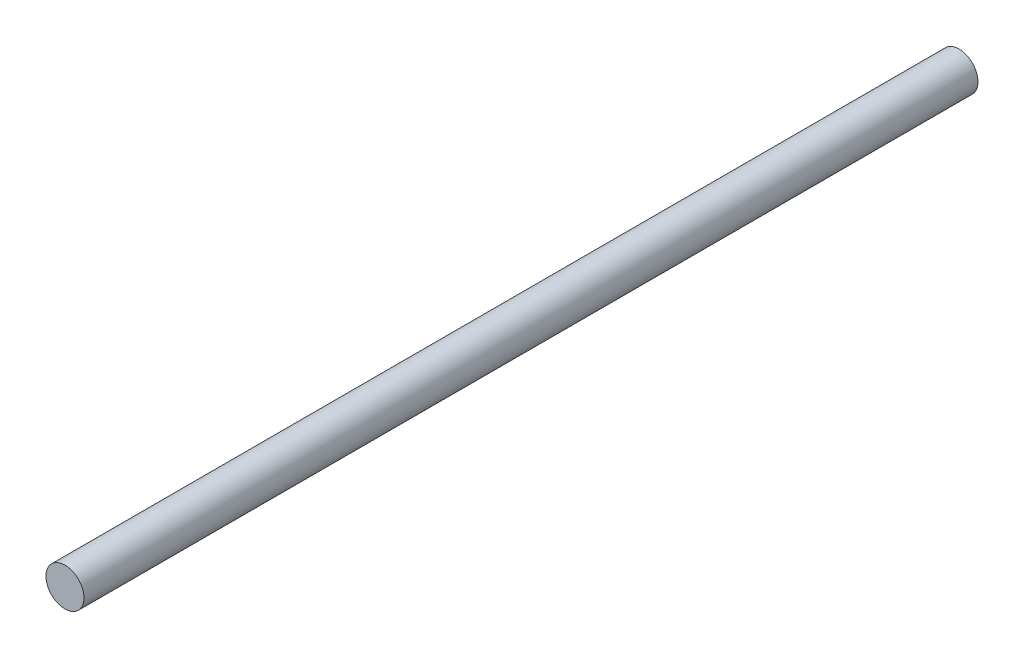
ISO-10303-21;
HEADER;
FILE_DESCRIPTION(('STEP AP214'),'2;1');
FILE_NAME('part.step','',(''),(''),'','','');
FILE_SCHEMA(('AUTOMOTIVE_DESIGN { 1 0 10303 214 1 1 1 1 }'));
ENDSEC;
DATA;
#1=APPLICATION_CONTEXT('core data for automotive mechanical design processes');
#2=APPLICATION_PROTOCOL_DEFINITION('international standard','automotive_design',2000,#1);
#3=PRODUCT_CONTEXT('',#1,'mechanical');
#4=PRODUCT('Part','Part','',(#3));
#5=PRODUCT_RELATED_PRODUCT_CATEGORY('part','',(#4));
#6=PRODUCT_DEFINITION_FORMATION('','',#4);
#7=PRODUCT_DEFINITION_CONTEXT('part definition',#1,'design');
#8=PRODUCT_DEFINITION('design','',#6,#7);
#9=PRODUCT_DEFINITION_SHAPE('','',#8);
#10=(LENGTH_UNIT() NAMED_UNIT(*) SI_UNIT(.MILLI.,.METRE.));
#11=(NAMED_UNIT(*) PLANE_ANGLE_UNIT() SI_UNIT($,.RADIAN.));
#12=(NAMED_UNIT(*) SI_UNIT($,.STERADIAN.) SOLID_ANGLE_UNIT());
#13=UNCERTAINTY_MEASURE_WITH_UNIT(LENGTH_MEASURE(1.E-05),#10,'distance_accuracy_value','');
#14=(GEOMETRIC_REPRESENTATION_CONTEXT(3) GLOBAL_UNCERTAINTY_ASSIGNED_CONTEXT((#13)) GLOBAL_UNIT_ASSIGNED_CONTEXT((#10,
#11,#12)) REPRESENTATION_CONTEXT('',''));
#15=CARTESIAN_POINT('',(0.,0.,0.));
#16=DIRECTION('',(0.,0.,1.));
#17=DIRECTION('',(1.,0.,0.));
#18=AXIS2_PLACEMENT_3D('',#15,#16,#17);
#19=CARTESIAN_POINT('',(0.,0.,149.352));
#20=DIRECTION('',(0.,0.,-1.));
#21=DIRECTION('',(-1.,0.,0.));
#22=AXIS2_PLACEMENT_3D('',#19,#20,#21);
#23=CYLINDRICAL_SURFACE('',#22,3.175);
#24=CARTESIAN_POINT('',(0.,0.,149.352));
#25=DIRECTION('',(0.,0.,1.));
#26=DIRECTION('',(1.,0.,0.));
#27=AXIS2_PLACEMENT_3D('',#24,#25,#26);
#28=CIRCLE('',#27,3.175);
#29=CARTESIAN_POINT('',(3.175,0.,149.352));
#30=VERTEX_POINT('',#29);
#31=EDGE_CURVE('E10',#30,#30,#28,.T.);
#32=ORIENTED_EDGE('',*,*,#31,.F.);
#33=EDGE_LOOP('',(#32));
#34=FACE_BOUND('',#33,.T.);
#35=CARTESIAN_POINT('',(0.,0.,0.));
#36=DIRECTION('',(0.,0.,1.));
#37=DIRECTION('',(1.,0.,0.));
#38=AXIS2_PLACEMENT_3D('',#35,#36,#37);
#39=CIRCLE('',#38,3.175);
#40=CARTESIAN_POINT('',(3.175,0.,0.));
#41=VERTEX_POINT('',#40);
#42=EDGE_CURVE('E40',#41,#41,#39,.T.);
#43=ORIENTED_EDGE('',*,*,#42,.T.);
#44=EDGE_LOOP('',(#43));
#45=FACE_BOUND('',#44,.T.);
#46=ADVANCED_FACE('F37',(#34,#45),#23,.T.);
#47=CARTESIAN_POINT('',(0.,0.,149.352));
#48=DIRECTION('',(0.,0.,1.));
#49=DIRECTION('',(1.,0.,0.));
#50=AXIS2_PLACEMENT_3D('',#47,#48,#49);
#51=PLANE('',#50);
#52=ORIENTED_EDGE('',*,*,#31,.T.);
#53=EDGE_LOOP('',(#52));
#54=FACE_BOUND('',#53,.T.);
#55=ADVANCED_FACE('F54',(#54),#51,.T.);
#56=CARTESIAN_POINT('',(0.,0.,0.));
#57=DIRECTION('',(0.,0.,1.));
#58=DIRECTION('',(1.,0.,0.));
#59=AXIS2_PLACEMENT_3D('',#56,#57,#58);
#60=PLANE('',#59);
#61=ORIENTED_EDGE('',*,*,#42,.F.);
#62=EDGE_LOOP('',(#61));
#63=FACE_BOUND('',#62,.T.);
#64=ADVANCED_FACE('F52',(#63),#60,.F.);
#65=CLOSED_SHELL('',(#46,#55,#64));
#66=MANIFOLD_SOLID_BREP('B2',#65);
#67=ADVANCED_BREP_SHAPE_REPRESENTATION('',(#18,#66),#14);
#68=SHAPE_DEFINITION_REPRESENTATION(#9,#67);
ENDSEC;
END-ISO-10303-21;
